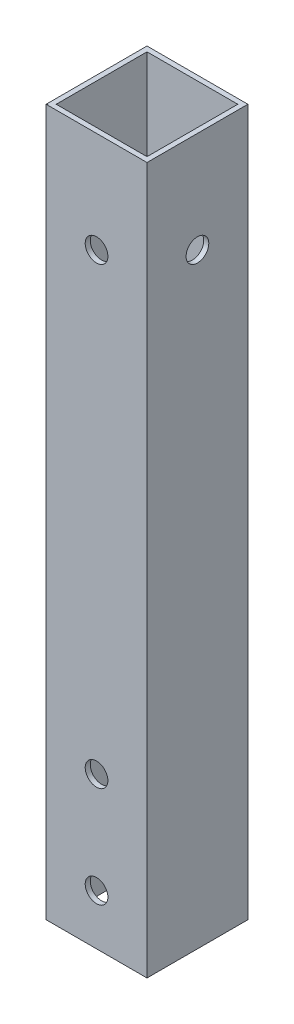
ISO-10303-21;
HEADER;
FILE_DESCRIPTION(('STEP AP214'),'2;1');
FILE_NAME('part.step','',(''),(''),'','','');
FILE_SCHEMA(('AUTOMOTIVE_DESIGN { 1 0 10303 214 1 1 1 1 }'));
ENDSEC;
DATA;
#1=APPLICATION_CONTEXT('core data for automotive mechanical design processes');
#2=APPLICATION_PROTOCOL_DEFINITION('international standard','automotive_design',2000,#1);
#3=PRODUCT_CONTEXT('',#1,'mechanical');
#4=PRODUCT('Part','Part','',(#3));
#5=PRODUCT_RELATED_PRODUCT_CATEGORY('part','',(#4));
#6=PRODUCT_DEFINITION_FORMATION('','',#4);
#7=PRODUCT_DEFINITION_CONTEXT('part definition',#1,'design');
#8=PRODUCT_DEFINITION('design','',#6,#7);
#9=PRODUCT_DEFINITION_SHAPE('','',#8);
#10=(LENGTH_UNIT() NAMED_UNIT(*) SI_UNIT(.MILLI.,.METRE.));
#11=(NAMED_UNIT(*) PLANE_ANGLE_UNIT() SI_UNIT($,.RADIAN.));
#12=(NAMED_UNIT(*) SI_UNIT($,.STERADIAN.) SOLID_ANGLE_UNIT());
#13=UNCERTAINTY_MEASURE_WITH_UNIT(LENGTH_MEASURE(1.E-05),#10,'distance_accuracy_value','');
#14=(GEOMETRIC_REPRESENTATION_CONTEXT(3) GLOBAL_UNCERTAINTY_ASSIGNED_CONTEXT((#13)) GLOBAL_UNIT_ASSIGNED_CONTEXT((#10,
#11,#12)) REPRESENTATION_CONTEXT('',''));
#15=CARTESIAN_POINT('',(0.,0.,0.));
#16=DIRECTION('',(0.,0.,1.));
#17=DIRECTION('',(1.,0.,0.));
#18=AXIS2_PLACEMENT_3D('',#15,#16,#17);
#19=CARTESIAN_POINT('',(0.,140.,0.));
#20=DIRECTION('',(0.,-1.,0.));
#21=DIRECTION('',(0.,0.,-1.));
#22=AXIS2_PLACEMENT_3D('',#19,#20,#21);
#23=PLANE('',#22);
#24=DIRECTION('',(0.,0.,-1.));
#25=VECTOR('',#24,1.);
#26=CARTESIAN_POINT('',(10.,140.,10.));
#27=LINE('',#26,#25);
#28=CARTESIAN_POINT('',(10.,140.,10.));
#29=VERTEX_POINT('',#28);
#30=CARTESIAN_POINT('',(10.,140.,-10.));
#31=VERTEX_POINT('',#30);
#32=EDGE_CURVE('E142',#29,#31,#27,.T.);
#33=ORIENTED_EDGE('',*,*,#32,.T.);
#34=DIRECTION('',(-1.,0.,0.));
#35=VECTOR('',#34,1.);
#36=CARTESIAN_POINT('',(-10.,140.,-10.));
#37=LINE('',#36,#35);
#38=CARTESIAN_POINT('',(-10.,140.,-10.));
#39=VERTEX_POINT('',#38);
#40=EDGE_CURVE('E145',#31,#39,#37,.T.);
#41=ORIENTED_EDGE('',*,*,#40,.T.);
#42=DIRECTION('',(0.,0.,1.));
#43=VECTOR('',#42,1.);
#44=CARTESIAN_POINT('',(-10.,140.,10.));
#45=LINE('',#44,#43);
#46=CARTESIAN_POINT('',(-10.,140.,10.));
#47=VERTEX_POINT('',#46);
#48=EDGE_CURVE('E148',#39,#47,#45,.T.);
#49=ORIENTED_EDGE('',*,*,#48,.T.);
#50=DIRECTION('',(1.,0.,0.));
#51=VECTOR('',#50,1.);
#52=CARTESIAN_POINT('',(-10.,140.,10.));
#53=LINE('',#52,#51);
#54=EDGE_CURVE('E150',#47,#29,#53,.T.);
#55=ORIENTED_EDGE('',*,*,#54,.T.);
#56=EDGE_LOOP('',(#33,#41,#49,#55));
#57=FACE_BOUND('',#56,.T.);
#58=DIRECTION('',(1.,0.,0.));
#59=VECTOR('',#58,1.);
#60=CARTESIAN_POINT('',(-9.,140.,9.));
#61=LINE('',#60,#59);
#62=CARTESIAN_POINT('',(-9.,140.,9.));
#63=VERTEX_POINT('',#62);
#64=CARTESIAN_POINT('',(9.,140.,9.));
#65=VERTEX_POINT('',#64);
#66=EDGE_CURVE('E104',#63,#65,#61,.T.);
#67=ORIENTED_EDGE('',*,*,#66,.F.);
#68=DIRECTION('',(0.,0.,1.));
#69=VECTOR('',#68,1.);
#70=CARTESIAN_POINT('',(-9.,140.,9.));
#71=LINE('',#70,#69);
#72=CARTESIAN_POINT('',(-9.,140.,-9.));
#73=VERTEX_POINT('',#72);
#74=EDGE_CURVE('E126',#73,#63,#71,.T.);
#75=ORIENTED_EDGE('',*,*,#74,.F.);
#76=DIRECTION('',(-1.,0.,0.));
#77=VECTOR('',#76,1.);
#78=CARTESIAN_POINT('',(-9.,140.,-9.));
#79=LINE('',#78,#77);
#80=CARTESIAN_POINT('',(9.,140.,-9.));
#81=VERTEX_POINT('',#80);
#82=EDGE_CURVE('E124',#81,#73,#79,.T.);
#83=ORIENTED_EDGE('',*,*,#82,.F.);
#84=DIRECTION('',(0.,0.,-1.));
#85=VECTOR('',#84,1.);
#86=CARTESIAN_POINT('',(9.,140.,9.));
#87=LINE('',#86,#85);
#88=EDGE_CURVE('E112',#65,#81,#87,.T.);
#89=ORIENTED_EDGE('',*,*,#88,.F.);
#90=EDGE_LOOP('',(#67,#75,#83,#89));
#91=FACE_BOUND('',#90,.T.);
#92=ADVANCED_FACE('F37',(#57,#91),#23,.F.);
#93=CARTESIAN_POINT('',(0.,0.,0.));
#94=DIRECTION('',(0.,-1.,0.));
#95=DIRECTION('',(0.,0.,-1.));
#96=AXIS2_PLACEMENT_3D('',#93,#94,#95);
#97=PLANE('',#96);
#98=DIRECTION('',(0.,0.,-1.));
#99=VECTOR('',#98,1.);
#100=CARTESIAN_POINT('',(10.,0.,10.));
#101=LINE('',#100,#99);
#102=CARTESIAN_POINT('',(10.,0.,10.));
#103=VERTEX_POINT('',#102);
#104=CARTESIAN_POINT('',(10.,0.,-10.));
#105=VERTEX_POINT('',#104);
#106=EDGE_CURVE('E120',#103,#105,#101,.T.);
#107=ORIENTED_EDGE('',*,*,#106,.F.);
#108=DIRECTION('',(1.,0.,0.));
#109=VECTOR('',#108,1.);
#110=CARTESIAN_POINT('',(-10.,0.,10.));
#111=LINE('',#110,#109);
#112=CARTESIAN_POINT('',(-10.,0.,10.));
#113=VERTEX_POINT('',#112);
#114=EDGE_CURVE('E146',#113,#103,#111,.T.);
#115=ORIENTED_EDGE('',*,*,#114,.F.);
#116=DIRECTION('',(0.,0.,1.));
#117=VECTOR('',#116,1.);
#118=CARTESIAN_POINT('',(-10.,0.,10.));
#119=LINE('',#118,#117);
#120=CARTESIAN_POINT('',(-10.,0.,-10.));
#121=VERTEX_POINT('',#120);
#122=EDGE_CURVE('E157',#121,#113,#119,.T.);
#123=ORIENTED_EDGE('',*,*,#122,.F.);
#124=DIRECTION('',(-1.,0.,0.));
#125=VECTOR('',#124,1.);
#126=CARTESIAN_POINT('',(-10.,0.,-10.));
#127=LINE('',#126,#125);
#128=EDGE_CURVE('E155',#105,#121,#127,.T.);
#129=ORIENTED_EDGE('',*,*,#128,.F.);
#130=EDGE_LOOP('',(#107,#115,#123,#129));
#131=FACE_BOUND('',#130,.T.);
#132=DIRECTION('',(0.,0.,1.));
#133=VECTOR('',#132,1.);
#134=CARTESIAN_POINT('',(-9.,0.,9.));
#135=LINE('',#134,#133);
#136=CARTESIAN_POINT('',(-9.,0.,-9.));
#137=VERTEX_POINT('',#136);
#138=CARTESIAN_POINT('',(-9.,0.,9.));
#139=VERTEX_POINT('',#138);
#140=EDGE_CURVE('E113',#137,#139,#135,.T.);
#141=ORIENTED_EDGE('',*,*,#140,.T.);
#142=DIRECTION('',(1.,0.,0.));
#143=VECTOR('',#142,1.);
#144=CARTESIAN_POINT('',(-9.,0.,9.));
#145=LINE('',#144,#143);
#146=CARTESIAN_POINT('',(9.,0.,9.));
#147=VERTEX_POINT('',#146);
#148=EDGE_CURVE('E62',#139,#147,#145,.T.);
#149=ORIENTED_EDGE('',*,*,#148,.T.);
#150=DIRECTION('',(0.,0.,-1.));
#151=VECTOR('',#150,1.);
#152=CARTESIAN_POINT('',(9.,0.,9.));
#153=LINE('',#152,#151);
#154=CARTESIAN_POINT('',(9.,0.,-9.));
#155=VERTEX_POINT('',#154);
#156=EDGE_CURVE('E119',#147,#155,#153,.T.);
#157=ORIENTED_EDGE('',*,*,#156,.T.);
#158=DIRECTION('',(-1.,0.,0.));
#159=VECTOR('',#158,1.);
#160=CARTESIAN_POINT('',(-9.,0.,-9.));
#161=LINE('',#160,#159);
#162=EDGE_CURVE('E134',#155,#137,#161,.T.);
#163=ORIENTED_EDGE('',*,*,#162,.T.);
#164=EDGE_LOOP('',(#141,#149,#157,#163));
#165=FACE_BOUND('',#164,.T.);
#166=ADVANCED_FACE('F227',(#131,#165),#97,.T.);
#167=CARTESIAN_POINT('',(10.,140.,10.));
#168=DIRECTION('',(-1.,0.,0.));
#169=DIRECTION('',(0.,0.,1.));
#170=AXIS2_PLACEMENT_3D('',#167,#168,#169);
#171=PLANE('',#170);
#172=CARTESIAN_POINT('',(10.,120.,0.));
#173=DIRECTION('',(1.,0.,0.));
#174=DIRECTION('',(0.,0.,-1.));
#175=AXIS2_PLACEMENT_3D('',#172,#173,#174);
#176=CIRCLE('',#175,2.25);
#177=CARTESIAN_POINT('',(10.,120.,-2.25));
#178=VERTEX_POINT('',#177);
#179=EDGE_CURVE('E207',#178,#178,#176,.T.);
#180=ORIENTED_EDGE('',*,*,#179,.F.);
#181=EDGE_LOOP('',(#180));
#182=FACE_BOUND('',#181,.T.);
#183=ORIENTED_EDGE('',*,*,#106,.T.);
#184=DIRECTION('',(0.,-1.,0.));
#185=VECTOR('',#184,1.);
#186=CARTESIAN_POINT('',(10.,140.,-10.));
#187=LINE('',#186,#185);
#188=EDGE_CURVE('E11',#31,#105,#187,.T.);
#189=ORIENTED_EDGE('',*,*,#188,.F.);
#190=ORIENTED_EDGE('',*,*,#32,.F.);
#191=DIRECTION('',(0.,-1.,0.));
#192=VECTOR('',#191,1.);
#193=CARTESIAN_POINT('',(10.,140.,10.));
#194=LINE('',#193,#192);
#195=EDGE_CURVE('E152',#29,#103,#194,.T.);
#196=ORIENTED_EDGE('',*,*,#195,.T.);
#197=EDGE_LOOP('',(#183,#189,#190,#196));
#198=FACE_BOUND('',#197,.T.);
#199=ADVANCED_FACE('F39',(#182,#198),#171,.F.);
#200=CARTESIAN_POINT('',(-10.,140.,-10.));
#201=DIRECTION('',(0.,0.,1.));
#202=DIRECTION('',(1.,0.,0.));
#203=AXIS2_PLACEMENT_3D('',#200,#201,#202);
#204=PLANE('',#203);
#205=CARTESIAN_POINT('',(0.,10.,-10.));
#206=DIRECTION('',(0.,0.,1.));
#207=DIRECTION('',(1.,0.,0.));
#208=AXIS2_PLACEMENT_3D('',#205,#206,#207);
#209=CIRCLE('',#208,2.25);
#210=CARTESIAN_POINT('',(2.25,10.,-10.));
#211=VERTEX_POINT('',#210);
#212=EDGE_CURVE('E171',#211,#211,#209,.T.);
#213=ORIENTED_EDGE('',*,*,#212,.T.);
#214=EDGE_LOOP('',(#213));
#215=FACE_BOUND('',#214,.T.);
#216=CARTESIAN_POINT('',(0.,30.,-10.));
#217=DIRECTION('',(0.,0.,1.));
#218=DIRECTION('',(1.,0.,0.));
#219=AXIS2_PLACEMENT_3D('',#216,#217,#218);
#220=CIRCLE('',#219,2.25);
#221=CARTESIAN_POINT('',(2.25,30.,-10.));
#222=VERTEX_POINT('',#221);
#223=EDGE_CURVE('E194',#222,#222,#220,.T.);
#224=ORIENTED_EDGE('',*,*,#223,.T.);
#225=EDGE_LOOP('',(#224));
#226=FACE_BOUND('',#225,.T.);
#227=CARTESIAN_POINT('',(0.,120.,-10.));
#228=DIRECTION('',(0.,0.,1.));
#229=DIRECTION('',(1.,0.,0.));
#230=AXIS2_PLACEMENT_3D('',#227,#228,#229);
#231=CIRCLE('',#230,2.25);
#232=CARTESIAN_POINT('',(2.25,120.,-10.));
#233=VERTEX_POINT('',#232);
#234=EDGE_CURVE('E187',#233,#233,#231,.T.);
#235=ORIENTED_EDGE('',*,*,#234,.T.);
#236=EDGE_LOOP('',(#235));
#237=FACE_BOUND('',#236,.T.);
#238=ORIENTED_EDGE('',*,*,#128,.T.);
#239=DIRECTION('',(0.,-1.,0.));
#240=VECTOR('',#239,1.);
#241=CARTESIAN_POINT('',(-10.,140.,-10.));
#242=LINE('',#241,#240);
#243=EDGE_CURVE('E46',#39,#121,#242,.T.);
#244=ORIENTED_EDGE('',*,*,#243,.F.);
#245=ORIENTED_EDGE('',*,*,#40,.F.);
#246=ORIENTED_EDGE('',*,*,#188,.T.);
#247=EDGE_LOOP('',(#238,#244,#245,#246));
#248=FACE_BOUND('',#247,.T.);
#249=ADVANCED_FACE('F254',(#215,#226,#237,#248),#204,.F.);
#250=CARTESIAN_POINT('',(-10.,140.,10.));
#251=DIRECTION('',(1.,0.,0.));
#252=DIRECTION('',(0.,0.,-1.));
#253=AXIS2_PLACEMENT_3D('',#250,#251,#252);
#254=PLANE('',#253);
#255=CARTESIAN_POINT('',(-10.,120.,0.));
#256=DIRECTION('',(1.,0.,0.));
#257=DIRECTION('',(0.,0.,-1.));
#258=AXIS2_PLACEMENT_3D('',#255,#256,#257);
#259=CIRCLE('',#258,2.25);
#260=CARTESIAN_POINT('',(-10.,120.,-2.25));
#261=VERTEX_POINT('',#260);
#262=EDGE_CURVE('E210',#261,#261,#259,.T.);
#263=ORIENTED_EDGE('',*,*,#262,.T.);
#264=EDGE_LOOP('',(#263));
#265=FACE_BOUND('',#264,.T.);
#266=ORIENTED_EDGE('',*,*,#122,.T.);
#267=DIRECTION('',(0.,-1.,0.));
#268=VECTOR('',#267,1.);
#269=CARTESIAN_POINT('',(-10.,140.,10.));
#270=LINE('',#269,#268);
#271=EDGE_CURVE('E162',#47,#113,#270,.T.);
#272=ORIENTED_EDGE('',*,*,#271,.F.);
#273=ORIENTED_EDGE('',*,*,#48,.F.);
#274=ORIENTED_EDGE('',*,*,#243,.T.);
#275=EDGE_LOOP('',(#266,#272,#273,#274));
#276=FACE_BOUND('',#275,.T.);
#277=ADVANCED_FACE('F251',(#265,#276),#254,.F.);
#278=CARTESIAN_POINT('',(-10.,140.,10.));
#279=DIRECTION('',(0.,0.,-1.));
#280=DIRECTION('',(-1.,0.,0.));
#281=AXIS2_PLACEMENT_3D('',#278,#279,#280);
#282=PLANE('',#281);
#283=CARTESIAN_POINT('',(0.,10.,10.));
#284=DIRECTION('',(0.,0.,1.));
#285=DIRECTION('',(1.,0.,0.));
#286=AXIS2_PLACEMENT_3D('',#283,#284,#285);
#287=CIRCLE('',#286,2.25);
#288=CARTESIAN_POINT('',(2.25,10.,10.));
#289=VERTEX_POINT('',#288);
#290=EDGE_CURVE('E200',#289,#289,#287,.T.);
#291=ORIENTED_EDGE('',*,*,#290,.F.);
#292=EDGE_LOOP('',(#291));
#293=FACE_BOUND('',#292,.T.);
#294=CARTESIAN_POINT('',(0.,30.,10.));
#295=DIRECTION('',(0.,0.,1.));
#296=DIRECTION('',(1.,0.,0.));
#297=AXIS2_PLACEMENT_3D('',#294,#295,#296);
#298=CIRCLE('',#297,2.25);
#299=CARTESIAN_POINT('',(2.25,30.,10.));
#300=VERTEX_POINT('',#299);
#301=EDGE_CURVE('E197',#300,#300,#298,.T.);
#302=ORIENTED_EDGE('',*,*,#301,.F.);
#303=EDGE_LOOP('',(#302));
#304=FACE_BOUND('',#303,.T.);
#305=CARTESIAN_POINT('',(0.,120.,10.));
#306=DIRECTION('',(0.,0.,1.));
#307=DIRECTION('',(1.,0.,0.));
#308=AXIS2_PLACEMENT_3D('',#305,#306,#307);
#309=CIRCLE('',#308,2.25);
#310=CARTESIAN_POINT('',(2.25,120.,10.));
#311=VERTEX_POINT('',#310);
#312=EDGE_CURVE('E190',#311,#311,#309,.T.);
#313=ORIENTED_EDGE('',*,*,#312,.F.);
#314=EDGE_LOOP('',(#313));
#315=FACE_BOUND('',#314,.T.);
#316=ORIENTED_EDGE('',*,*,#114,.T.);
#317=ORIENTED_EDGE('',*,*,#195,.F.);
#318=ORIENTED_EDGE('',*,*,#54,.F.);
#319=ORIENTED_EDGE('',*,*,#271,.T.);
#320=EDGE_LOOP('',(#316,#317,#318,#319));
#321=FACE_BOUND('',#320,.T.);
#322=ADVANCED_FACE('F248',(#293,#304,#315,#321),#282,.F.);
#323=CARTESIAN_POINT('',(-9.,140.,9.));
#324=DIRECTION('',(0.,0.,-1.));
#325=DIRECTION('',(-1.,0.,0.));
#326=AXIS2_PLACEMENT_3D('',#323,#324,#325);
#327=PLANE('',#326);
#328=CARTESIAN_POINT('',(0.,10.,9.));
#329=DIRECTION('',(0.,0.,-1.));
#330=DIRECTION('',(-1.,0.,0.));
#331=AXIS2_PLACEMENT_3D('',#328,#329,#330);
#332=CIRCLE('',#331,2.25);
#333=CARTESIAN_POINT('',(-2.25,10.,9.));
#334=VERTEX_POINT('',#333);
#335=EDGE_CURVE('E132',#334,#334,#332,.T.);
#336=ORIENTED_EDGE('',*,*,#335,.F.);
#337=EDGE_LOOP('',(#336));
#338=FACE_BOUND('',#337,.T.);
#339=CARTESIAN_POINT('',(0.,30.,9.));
#340=DIRECTION('',(0.,0.,-1.));
#341=DIRECTION('',(-1.,0.,0.));
#342=AXIS2_PLACEMENT_3D('',#339,#340,#341);
#343=CIRCLE('',#342,2.25);
#344=CARTESIAN_POINT('',(-2.25,30.,9.));
#345=VERTEX_POINT('',#344);
#346=EDGE_CURVE('E174',#345,#345,#343,.T.);
#347=ORIENTED_EDGE('',*,*,#346,.F.);
#348=EDGE_LOOP('',(#347));
#349=FACE_BOUND('',#348,.T.);
#350=CARTESIAN_POINT('',(0.,120.,9.));
#351=DIRECTION('',(0.,0.,-1.));
#352=DIRECTION('',(-1.,0.,0.));
#353=AXIS2_PLACEMENT_3D('',#350,#351,#352);
#354=CIRCLE('',#353,2.25);
#355=CARTESIAN_POINT('',(-2.25,120.,9.));
#356=VERTEX_POINT('',#355);
#357=EDGE_CURVE('E170',#356,#356,#354,.T.);
#358=ORIENTED_EDGE('',*,*,#357,.F.);
#359=EDGE_LOOP('',(#358));
#360=FACE_BOUND('',#359,.T.);
#361=ORIENTED_EDGE('',*,*,#148,.F.);
#362=DIRECTION('',(0.,-1.,0.));
#363=VECTOR('',#362,1.);
#364=CARTESIAN_POINT('',(-9.,140.,9.));
#365=LINE('',#364,#363);
#366=EDGE_CURVE('E108',#63,#139,#365,.T.);
#367=ORIENTED_EDGE('',*,*,#366,.F.);
#368=ORIENTED_EDGE('',*,*,#66,.T.);
#369=DIRECTION('',(0.,-1.,0.));
#370=VECTOR('',#369,1.);
#371=CARTESIAN_POINT('',(9.,140.,9.));
#372=LINE('',#371,#370);
#373=EDGE_CURVE('E107',#65,#147,#372,.T.);
#374=ORIENTED_EDGE('',*,*,#373,.T.);
#375=EDGE_LOOP('',(#361,#367,#368,#374));
#376=FACE_BOUND('',#375,.T.);
#377=ADVANCED_FACE('F106',(#338,#349,#360,#376),#327,.T.);
#378=CARTESIAN_POINT('',(9.,140.,9.));
#379=DIRECTION('',(-1.,0.,0.));
#380=DIRECTION('',(0.,0.,1.));
#381=AXIS2_PLACEMENT_3D('',#378,#379,#380);
#382=PLANE('',#381);
#383=CARTESIAN_POINT('',(9.,120.,0.));
#384=DIRECTION('',(-1.,0.,0.));
#385=DIRECTION('',(0.,0.,1.));
#386=AXIS2_PLACEMENT_3D('',#383,#384,#385);
#387=CIRCLE('',#386,2.25);
#388=CARTESIAN_POINT('',(9.,120.,2.25));
#389=VERTEX_POINT('',#388);
#390=EDGE_CURVE('E191',#389,#389,#387,.T.);
#391=ORIENTED_EDGE('',*,*,#390,.F.);
#392=EDGE_LOOP('',(#391));
#393=FACE_BOUND('',#392,.T.);
#394=ORIENTED_EDGE('',*,*,#156,.F.);
#395=ORIENTED_EDGE('',*,*,#373,.F.);
#396=ORIENTED_EDGE('',*,*,#88,.T.);
#397=DIRECTION('',(0.,-1.,0.));
#398=VECTOR('',#397,1.);
#399=CARTESIAN_POINT('',(9.,140.,-9.));
#400=LINE('',#399,#398);
#401=EDGE_CURVE('E121',#81,#155,#400,.T.);
#402=ORIENTED_EDGE('',*,*,#401,.T.);
#403=EDGE_LOOP('',(#394,#395,#396,#402));
#404=FACE_BOUND('',#403,.T.);
#405=ADVANCED_FACE('F116',(#393,#404),#382,.T.);
#406=CARTESIAN_POINT('',(-9.,140.,-9.));
#407=DIRECTION('',(0.,0.,1.));
#408=DIRECTION('',(1.,0.,0.));
#409=AXIS2_PLACEMENT_3D('',#406,#407,#408);
#410=PLANE('',#409);
#411=CARTESIAN_POINT('',(0.,10.,-9.));
#412=DIRECTION('',(0.,0.,1.));
#413=DIRECTION('',(1.,0.,0.));
#414=AXIS2_PLACEMENT_3D('',#411,#412,#413);
#415=CIRCLE('',#414,2.25);
#416=CARTESIAN_POINT('',(2.25,10.,-9.));
#417=VERTEX_POINT('',#416);
#418=EDGE_CURVE('E175',#417,#417,#415,.T.);
#419=ORIENTED_EDGE('',*,*,#418,.F.);
#420=EDGE_LOOP('',(#419));
#421=FACE_BOUND('',#420,.T.);
#422=CARTESIAN_POINT('',(0.,30.,-9.));
#423=DIRECTION('',(0.,0.,1.));
#424=DIRECTION('',(1.,0.,0.));
#425=AXIS2_PLACEMENT_3D('',#422,#423,#424);
#426=CIRCLE('',#425,2.25);
#427=CARTESIAN_POINT('',(2.25,30.,-9.));
#428=VERTEX_POINT('',#427);
#429=EDGE_CURVE('E172',#428,#428,#426,.T.);
#430=ORIENTED_EDGE('',*,*,#429,.F.);
#431=EDGE_LOOP('',(#430));
#432=FACE_BOUND('',#431,.T.);
#433=CARTESIAN_POINT('',(0.,120.,-9.));
#434=DIRECTION('',(0.,0.,1.));
#435=DIRECTION('',(1.,0.,0.));
#436=AXIS2_PLACEMENT_3D('',#433,#434,#435);
#437=CIRCLE('',#436,2.25);
#438=CARTESIAN_POINT('',(2.25,120.,-9.));
#439=VERTEX_POINT('',#438);
#440=EDGE_CURVE('E167',#439,#439,#437,.T.);
#441=ORIENTED_EDGE('',*,*,#440,.F.);
#442=EDGE_LOOP('',(#441));
#443=FACE_BOUND('',#442,.T.);
#444=ORIENTED_EDGE('',*,*,#162,.F.);
#445=ORIENTED_EDGE('',*,*,#401,.F.);
#446=ORIENTED_EDGE('',*,*,#82,.T.);
#447=DIRECTION('',(0.,-1.,0.));
#448=VECTOR('',#447,1.);
#449=CARTESIAN_POINT('',(-9.,140.,-9.));
#450=LINE('',#449,#448);
#451=EDGE_CURVE('E54',#73,#137,#450,.T.);
#452=ORIENTED_EDGE('',*,*,#451,.T.);
#453=EDGE_LOOP('',(#444,#445,#446,#452));
#454=FACE_BOUND('',#453,.T.);
#455=ADVANCED_FACE('F223',(#421,#432,#443,#454),#410,.T.);
#456=CARTESIAN_POINT('',(-9.,140.,9.));
#457=DIRECTION('',(1.,0.,0.));
#458=DIRECTION('',(0.,0.,-1.));
#459=AXIS2_PLACEMENT_3D('',#456,#457,#458);
#460=PLANE('',#459);
#461=CARTESIAN_POINT('',(-9.,120.,0.));
#462=DIRECTION('',(1.,0.,0.));
#463=DIRECTION('',(0.,0.,-1.));
#464=AXIS2_PLACEMENT_3D('',#461,#462,#463);
#465=CIRCLE('',#464,2.25);
#466=CARTESIAN_POINT('',(-9.,120.,-2.25));
#467=VERTEX_POINT('',#466);
#468=EDGE_CURVE('E41',#467,#467,#465,.T.);
#469=ORIENTED_EDGE('',*,*,#468,.F.);
#470=EDGE_LOOP('',(#469));
#471=FACE_BOUND('',#470,.T.);
#472=ORIENTED_EDGE('',*,*,#140,.F.);
#473=ORIENTED_EDGE('',*,*,#451,.F.);
#474=ORIENTED_EDGE('',*,*,#74,.T.);
#475=ORIENTED_EDGE('',*,*,#366,.T.);
#476=EDGE_LOOP('',(#472,#473,#474,#475));
#477=FACE_BOUND('',#476,.T.);
#478=ADVANCED_FACE('F220',(#471,#477),#460,.T.);
#479=CARTESIAN_POINT('',(0.,120.,-10.));
#480=DIRECTION('',(0.,0.,1.));
#481=DIRECTION('',(1.,0.,0.));
#482=AXIS2_PLACEMENT_3D('',#479,#480,#481);
#483=CYLINDRICAL_SURFACE('',#482,2.25);
#484=ORIENTED_EDGE('',*,*,#440,.T.);
#485=EDGE_LOOP('',(#484));
#486=FACE_BOUND('',#485,.T.);
#487=ORIENTED_EDGE('',*,*,#234,.F.);
#488=EDGE_LOOP('',(#487));
#489=FACE_BOUND('',#488,.T.);
#490=ADVANCED_FACE('F222',(#486,#489),#483,.F.);
#491=CARTESIAN_POINT('',(0.,30.,-10.));
#492=DIRECTION('',(0.,0.,1.));
#493=DIRECTION('',(1.,0.,0.));
#494=AXIS2_PLACEMENT_3D('',#491,#492,#493);
#495=CYLINDRICAL_SURFACE('',#494,2.25);
#496=ORIENTED_EDGE('',*,*,#429,.T.);
#497=EDGE_LOOP('',(#496));
#498=FACE_BOUND('',#497,.T.);
#499=ORIENTED_EDGE('',*,*,#223,.F.);
#500=EDGE_LOOP('',(#499));
#501=FACE_BOUND('',#500,.T.);
#502=ADVANCED_FACE('F282',(#498,#501),#495,.F.);
#503=CARTESIAN_POINT('',(0.,10.,-10.));
#504=DIRECTION('',(0.,0.,1.));
#505=DIRECTION('',(1.,0.,0.));
#506=AXIS2_PLACEMENT_3D('',#503,#504,#505);
#507=CYLINDRICAL_SURFACE('',#506,2.25);
#508=ORIENTED_EDGE('',*,*,#418,.T.);
#509=EDGE_LOOP('',(#508));
#510=FACE_BOUND('',#509,.T.);
#511=ORIENTED_EDGE('',*,*,#212,.F.);
#512=EDGE_LOOP('',(#511));
#513=FACE_BOUND('',#512,.T.);
#514=ADVANCED_FACE('F289',(#510,#513),#507,.F.);
#515=ORIENTED_EDGE('',*,*,#357,.T.);
#516=EDGE_LOOP('',(#515));
#517=FACE_BOUND('',#516,.T.);
#518=ORIENTED_EDGE('',*,*,#312,.T.);
#519=EDGE_LOOP('',(#518));
#520=FACE_BOUND('',#519,.T.);
#521=ADVANCED_FACE('F285',(#517,#520),#483,.F.);
#522=ORIENTED_EDGE('',*,*,#346,.T.);
#523=EDGE_LOOP('',(#522));
#524=FACE_BOUND('',#523,.T.);
#525=ORIENTED_EDGE('',*,*,#301,.T.);
#526=EDGE_LOOP('',(#525));
#527=FACE_BOUND('',#526,.T.);
#528=ADVANCED_FACE('F292',(#524,#527),#495,.F.);
#529=ORIENTED_EDGE('',*,*,#335,.T.);
#530=EDGE_LOOP('',(#529));
#531=FACE_BOUND('',#530,.T.);
#532=ORIENTED_EDGE('',*,*,#290,.T.);
#533=EDGE_LOOP('',(#532));
#534=FACE_BOUND('',#533,.T.);
#535=ADVANCED_FACE('F299',(#531,#534),#507,.F.);
#536=CARTESIAN_POINT('',(-10.,120.,0.));
#537=DIRECTION('',(1.,0.,0.));
#538=DIRECTION('',(0.,0.,-1.));
#539=AXIS2_PLACEMENT_3D('',#536,#537,#538);
#540=CYLINDRICAL_SURFACE('',#539,2.25);
#541=ORIENTED_EDGE('',*,*,#468,.T.);
#542=EDGE_LOOP('',(#541));
#543=FACE_BOUND('',#542,.T.);
#544=ORIENTED_EDGE('',*,*,#262,.F.);
#545=EDGE_LOOP('',(#544));
#546=FACE_BOUND('',#545,.T.);
#547=ADVANCED_FACE('F217',(#543,#546),#540,.F.);
#548=ORIENTED_EDGE('',*,*,#390,.T.);
#549=EDGE_LOOP('',(#548));
#550=FACE_BOUND('',#549,.T.);
#551=ORIENTED_EDGE('',*,*,#179,.T.);
#552=EDGE_LOOP('',(#551));
#553=FACE_BOUND('',#552,.T.);
#554=ADVANCED_FACE('F322',(#550,#553),#540,.F.);
#555=CLOSED_SHELL('',(#92,#166,#199,#249,#277,#322,#377,#405,#455,#478,#490,#502,#514,#521,#528,
#535,#547,#554));
#556=MANIFOLD_SOLID_BREP('B2',#555);
#557=ADVANCED_BREP_SHAPE_REPRESENTATION('',(#18,#556),#14);
#558=SHAPE_DEFINITION_REPRESENTATION(#9,#557);
ENDSEC;
END-ISO-10303-21;
